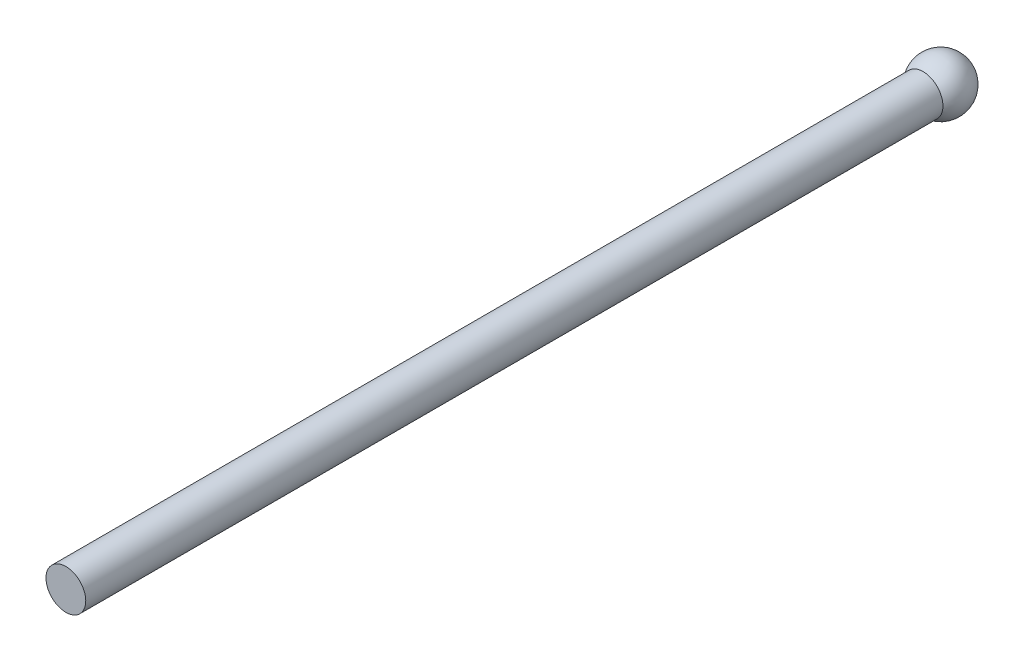
ISO-10303-21;
HEADER;
FILE_DESCRIPTION(('STEP AP214'),'2;1');
FILE_NAME('part.step','',(''),(''),'','','');
FILE_SCHEMA(('AUTOMOTIVE_DESIGN { 1 0 10303 214 1 1 1 1 }'));
ENDSEC;
DATA;
#1=APPLICATION_CONTEXT('core data for automotive mechanical design processes');
#2=APPLICATION_PROTOCOL_DEFINITION('international standard','automotive_design',2000,#1);
#3=PRODUCT_CONTEXT('',#1,'mechanical');
#4=PRODUCT('Part','Part','',(#3));
#5=PRODUCT_RELATED_PRODUCT_CATEGORY('part','',(#4));
#6=PRODUCT_DEFINITION_FORMATION('','',#4);
#7=PRODUCT_DEFINITION_CONTEXT('part definition',#1,'design');
#8=PRODUCT_DEFINITION('design','',#6,#7);
#9=PRODUCT_DEFINITION_SHAPE('','',#8);
#10=(LENGTH_UNIT() NAMED_UNIT(*) SI_UNIT(.MILLI.,.METRE.));
#11=(NAMED_UNIT(*) PLANE_ANGLE_UNIT() SI_UNIT($,.RADIAN.));
#12=(NAMED_UNIT(*) SI_UNIT($,.STERADIAN.) SOLID_ANGLE_UNIT());
#13=UNCERTAINTY_MEASURE_WITH_UNIT(LENGTH_MEASURE(1.E-05),#10,'distance_accuracy_value','');
#14=(GEOMETRIC_REPRESENTATION_CONTEXT(3) GLOBAL_UNCERTAINTY_ASSIGNED_CONTEXT((#13)) GLOBAL_UNIT_ASSIGNED_CONTEXT((#10,
#11,#12)) REPRESENTATION_CONTEXT('',''));
#15=CARTESIAN_POINT('',(0.,0.,0.));
#16=DIRECTION('',(0.,0.,1.));
#17=DIRECTION('',(1.,0.,0.));
#18=AXIS2_PLACEMENT_3D('',#15,#16,#17);
#19=CARTESIAN_POINT('',(0.,0.,330.));
#20=DIRECTION('',(0.,0.,-1.));
#21=DIRECTION('',(-1.,0.,0.));
#22=AXIS2_PLACEMENT_3D('',#19,#20,#21);
#23=CYLINDRICAL_SURFACE('',#22,7.5);
#24=CARTESIAN_POINT('',(0.,0.,330.));
#25=DIRECTION('',(0.,0.,1.));
#26=DIRECTION('',(1.,0.,0.));
#27=AXIS2_PLACEMENT_3D('',#24,#25,#26);
#28=CIRCLE('',#27,7.5);
#29=CARTESIAN_POINT('',(7.5,0.,330.));
#30=VERTEX_POINT('',#29);
#31=EDGE_CURVE('E43',#30,#30,#28,.T.);
#32=ORIENTED_EDGE('',*,*,#31,.F.);
#33=EDGE_LOOP('',(#32));
#34=FACE_BOUND('',#33,.T.);
#35=CARTESIAN_POINT('',(0.,0.,6.61437827766148));
#36=DIRECTION('',(0.,0.,-1.));
#37=DIRECTION('',(-1.,0.,0.));
#38=AXIS2_PLACEMENT_3D('',#35,#36,#37);
#39=CIRCLE('',#38,7.5);
#40=CARTESIAN_POINT('',(-7.5,0.,6.61437827766148));
#41=VERTEX_POINT('',#40);
#42=EDGE_CURVE('E10',#41,#41,#39,.T.);
#43=ORIENTED_EDGE('',*,*,#42,.F.);
#44=EDGE_LOOP('',(#43));
#45=FACE_BOUND('',#44,.T.);
#46=ADVANCED_FACE('F37',(#34,#45),#23,.T.);
#47=CARTESIAN_POINT('',(0.,0.,330.));
#48=DIRECTION('',(0.,0.,1.));
#49=DIRECTION('',(1.,0.,0.));
#50=AXIS2_PLACEMENT_3D('',#47,#48,#49);
#51=PLANE('',#50);
#52=ORIENTED_EDGE('',*,*,#31,.T.);
#53=EDGE_LOOP('',(#52));
#54=FACE_BOUND('',#53,.T.);
#55=ADVANCED_FACE('F49',(#54),#51,.T.);
#56=CARTESIAN_POINT('',(0.,0.,0.));
#57=DIRECTION('',(0.,0.,1.));
#58=DIRECTION('',(-1.,0.,0.));
#59=AXIS2_PLACEMENT_3D('',#56,#57,#58);
#60=SPHERICAL_SURFACE('',#59,10.);
#61=ORIENTED_EDGE('',*,*,#42,.T.);
#62=EDGE_LOOP('',(#61));
#63=FACE_BOUND('',#62,.T.);
#64=ADVANCED_FACE('F57',(#63),#60,.T.);
#65=CLOSED_SHELL('',(#46,#55,#64));
#66=MANIFOLD_SOLID_BREP('B2',#65);
#67=ADVANCED_BREP_SHAPE_REPRESENTATION('',(#18,#66),#14);
#68=SHAPE_DEFINITION_REPRESENTATION(#9,#67);
ENDSEC;
END-ISO-10303-21;
